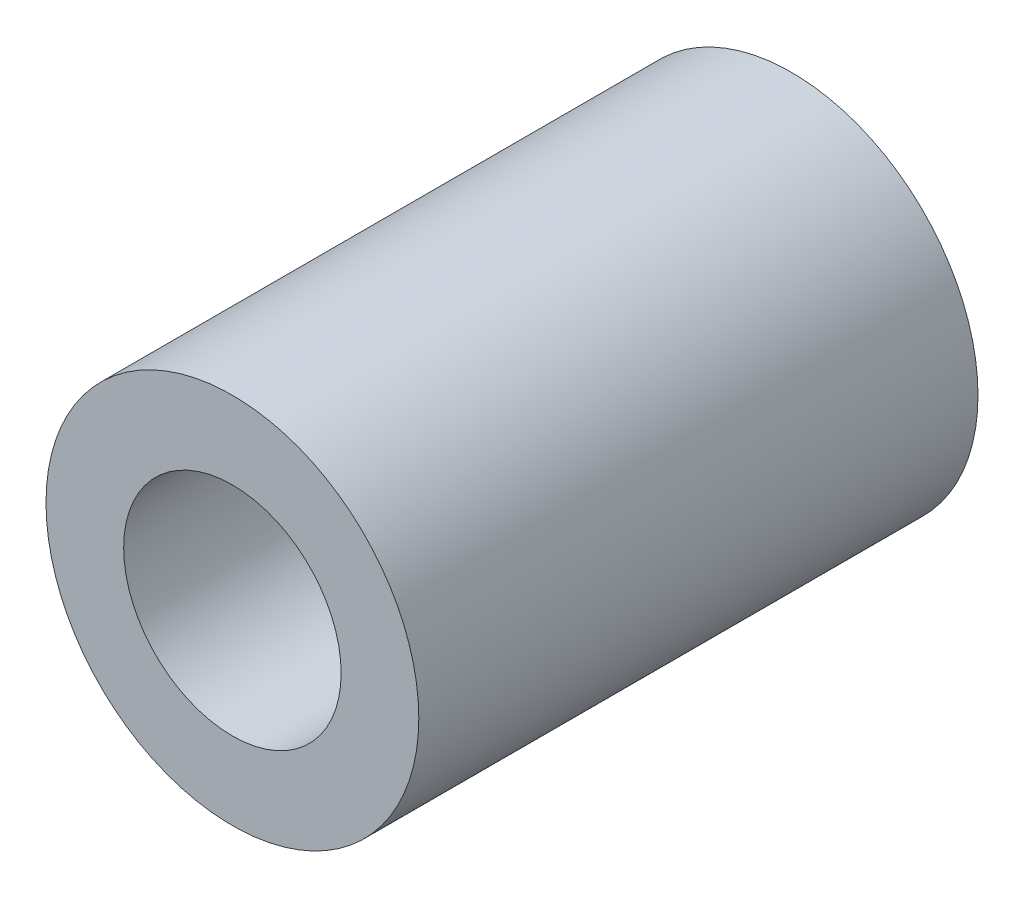
ISO-10303-21;
HEADER;
FILE_DESCRIPTION(('STEP AP214'),'2;1');
FILE_NAME('part.step','',(''),(''),'','','');
FILE_SCHEMA(('AUTOMOTIVE_DESIGN { 1 0 10303 214 1 1 1 1 }'));
ENDSEC;
DATA;
#1=APPLICATION_CONTEXT('core data for automotive mechanical design processes');
#2=APPLICATION_PROTOCOL_DEFINITION('international standard','automotive_design',2000,#1);
#3=PRODUCT_CONTEXT('',#1,'mechanical');
#4=PRODUCT('Part','Part','',(#3));
#5=PRODUCT_RELATED_PRODUCT_CATEGORY('part','',(#4));
#6=PRODUCT_DEFINITION_FORMATION('','',#4);
#7=PRODUCT_DEFINITION_CONTEXT('part definition',#1,'design');
#8=PRODUCT_DEFINITION('design','',#6,#7);
#9=PRODUCT_DEFINITION_SHAPE('','',#8);
#10=(LENGTH_UNIT() NAMED_UNIT(*) SI_UNIT(.MILLI.,.METRE.));
#11=(NAMED_UNIT(*) PLANE_ANGLE_UNIT() SI_UNIT($,.RADIAN.));
#12=(NAMED_UNIT(*) SI_UNIT($,.STERADIAN.) SOLID_ANGLE_UNIT());
#13=UNCERTAINTY_MEASURE_WITH_UNIT(LENGTH_MEASURE(1.E-05),#10,'distance_accuracy_value','');
#14=(GEOMETRIC_REPRESENTATION_CONTEXT(3) GLOBAL_UNCERTAINTY_ASSIGNED_CONTEXT((#13)) GLOBAL_UNIT_ASSIGNED_CONTEXT((#10,
#11,#12)) REPRESENTATION_CONTEXT('',''));
#15=CARTESIAN_POINT('',(0.,0.,0.));
#16=DIRECTION('',(0.,0.,1.));
#17=DIRECTION('',(1.,0.,0.));
#18=AXIS2_PLACEMENT_3D('',#15,#16,#17);
#19=CARTESIAN_POINT('',(0.,0.,18.));
#20=DIRECTION('',(0.,0.,1.));
#21=DIRECTION('',(1.,0.,0.));
#22=AXIS2_PLACEMENT_3D('',#19,#20,#21);
#23=PLANE('',#22);
#24=CARTESIAN_POINT('',(0.,0.,18.));
#25=DIRECTION('',(0.,0.,1.));
#26=DIRECTION('',(1.,0.,0.));
#27=AXIS2_PLACEMENT_3D('',#24,#25,#26);
#28=CIRCLE('',#27,6.);
#29=CARTESIAN_POINT('',(6.,0.,18.));
#30=VERTEX_POINT('',#29);
#31=EDGE_CURVE('E10',#30,#30,#28,.T.);
#32=ORIENTED_EDGE('',*,*,#31,.T.);
#33=EDGE_LOOP('',(#32));
#34=FACE_BOUND('',#33,.T.);
#35=CARTESIAN_POINT('',(0.,0.,18.));
#36=DIRECTION('',(0.,0.,1.));
#37=DIRECTION('',(1.,0.,0.));
#38=AXIS2_PLACEMENT_3D('',#35,#36,#37);
#39=CIRCLE('',#38,3.5);
#40=CARTESIAN_POINT('',(3.5,0.,18.));
#41=VERTEX_POINT('',#40);
#42=EDGE_CURVE('E45',#41,#41,#39,.T.);
#43=ORIENTED_EDGE('',*,*,#42,.F.);
#44=EDGE_LOOP('',(#43));
#45=FACE_BOUND('',#44,.T.);
#46=ADVANCED_FACE('F34',(#34,#45),#23,.T.);
#47=CARTESIAN_POINT('',(0.,0.,0.));
#48=DIRECTION('',(0.,0.,1.));
#49=DIRECTION('',(1.,0.,0.));
#50=AXIS2_PLACEMENT_3D('',#47,#48,#49);
#51=PLANE('',#50);
#52=CARTESIAN_POINT('',(0.,0.,0.));
#53=DIRECTION('',(0.,0.,1.));
#54=DIRECTION('',(1.,0.,0.));
#55=AXIS2_PLACEMENT_3D('',#52,#53,#54);
#56=CIRCLE('',#55,6.);
#57=CARTESIAN_POINT('',(6.,0.,0.));
#58=VERTEX_POINT('',#57);
#59=EDGE_CURVE('E38',#58,#58,#56,.T.);
#60=ORIENTED_EDGE('',*,*,#59,.F.);
#61=EDGE_LOOP('',(#60));
#62=FACE_BOUND('',#61,.T.);
#63=CARTESIAN_POINT('',(0.,0.,0.));
#64=DIRECTION('',(0.,0.,1.));
#65=DIRECTION('',(1.,0.,0.));
#66=AXIS2_PLACEMENT_3D('',#63,#64,#65);
#67=CIRCLE('',#66,3.5);
#68=CARTESIAN_POINT('',(3.5,0.,0.));
#69=VERTEX_POINT('',#68);
#70=EDGE_CURVE('E47',#69,#69,#67,.T.);
#71=ORIENTED_EDGE('',*,*,#70,.T.);
#72=EDGE_LOOP('',(#71));
#73=FACE_BOUND('',#72,.T.);
#74=ADVANCED_FACE('F57',(#62,#73),#51,.F.);
#75=CARTESIAN_POINT('',(0.,0.,18.));
#76=DIRECTION('',(0.,0.,-1.));
#77=DIRECTION('',(-1.,0.,0.));
#78=AXIS2_PLACEMENT_3D('',#75,#76,#77);
#79=CYLINDRICAL_SURFACE('',#78,6.);
#80=ORIENTED_EDGE('',*,*,#31,.F.);
#81=EDGE_LOOP('',(#80));
#82=FACE_BOUND('',#81,.T.);
#83=ORIENTED_EDGE('',*,*,#59,.T.);
#84=EDGE_LOOP('',(#83));
#85=FACE_BOUND('',#84,.T.);
#86=ADVANCED_FACE('F36',(#82,#85),#79,.T.);
#87=CARTESIAN_POINT('',(0.,0.,18.));
#88=DIRECTION('',(0.,0.,-1.));
#89=DIRECTION('',(-1.,0.,0.));
#90=AXIS2_PLACEMENT_3D('',#87,#88,#89);
#91=CYLINDRICAL_SURFACE('',#90,3.5);
#92=ORIENTED_EDGE('',*,*,#42,.T.);
#93=EDGE_LOOP('',(#92));
#94=FACE_BOUND('',#93,.T.);
#95=ORIENTED_EDGE('',*,*,#70,.F.);
#96=EDGE_LOOP('',(#95));
#97=FACE_BOUND('',#96,.T.);
#98=ADVANCED_FACE('F53',(#94,#97),#91,.F.);
#99=CLOSED_SHELL('',(#46,#74,#86,#98));
#100=MANIFOLD_SOLID_BREP('B2',#99);
#101=ADVANCED_BREP_SHAPE_REPRESENTATION('',(#18,#100),#14);
#102=SHAPE_DEFINITION_REPRESENTATION(#9,#101);
ENDSEC;
END-ISO-10303-21;
